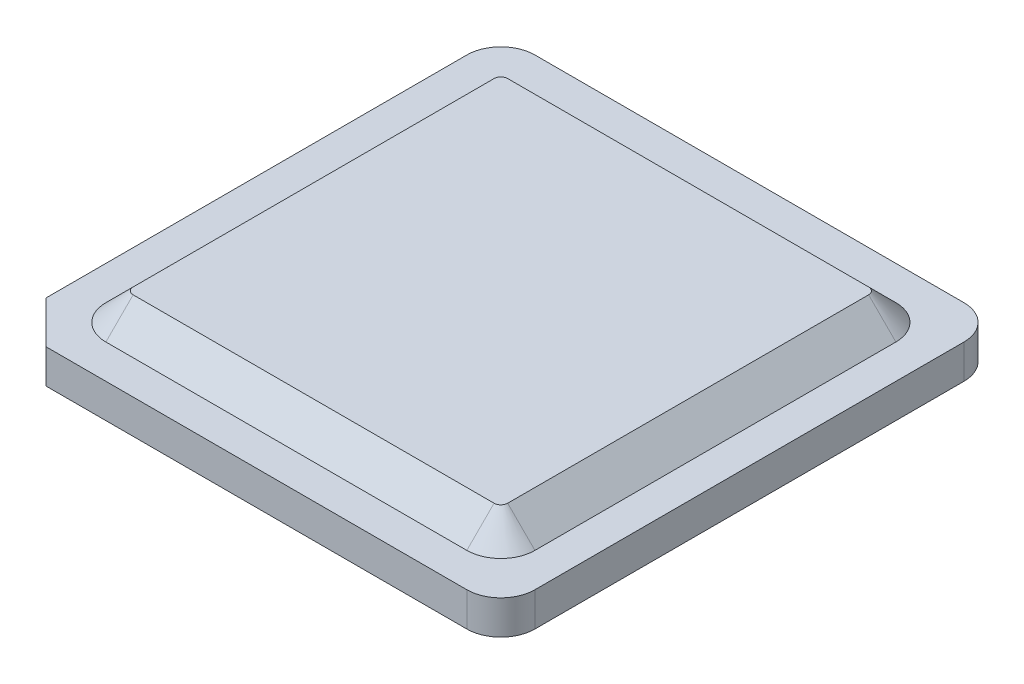
ISO-10303-21;
HEADER;
FILE_DESCRIPTION(('STEP AP214'),'2;1');
FILE_NAME('part.step','',(''),(''),'','','');
FILE_SCHEMA(('AUTOMOTIVE_DESIGN { 1 0 10303 214 1 1 1 1 }'));
ENDSEC;
DATA;
#1=APPLICATION_CONTEXT('core data for automotive mechanical design processes');
#2=APPLICATION_PROTOCOL_DEFINITION('international standard','automotive_design',2000,#1);
#3=PRODUCT_CONTEXT('',#1,'mechanical');
#4=PRODUCT('Part','Part','',(#3));
#5=PRODUCT_RELATED_PRODUCT_CATEGORY('part','',(#4));
#6=PRODUCT_DEFINITION_FORMATION('','',#4);
#7=PRODUCT_DEFINITION_CONTEXT('part definition',#1,'design');
#8=PRODUCT_DEFINITION('design','',#6,#7);
#9=PRODUCT_DEFINITION_SHAPE('','',#8);
#10=(LENGTH_UNIT() NAMED_UNIT(*) SI_UNIT(.MILLI.,.METRE.));
#11=(NAMED_UNIT(*) PLANE_ANGLE_UNIT() SI_UNIT($,.RADIAN.));
#12=(NAMED_UNIT(*) SI_UNIT($,.STERADIAN.) SOLID_ANGLE_UNIT());
#13=UNCERTAINTY_MEASURE_WITH_UNIT(LENGTH_MEASURE(1.E-05),#10,'distance_accuracy_value','');
#14=(GEOMETRIC_REPRESENTATION_CONTEXT(3) GLOBAL_UNCERTAINTY_ASSIGNED_CONTEXT((#13)) GLOBAL_UNIT_ASSIGNED_CONTEXT((#10,
#11,#12)) REPRESENTATION_CONTEXT('',''));
#15=CARTESIAN_POINT('',(0.,0.,0.));
#16=DIRECTION('',(0.,0.,1.));
#17=DIRECTION('',(1.,0.,0.));
#18=AXIS2_PLACEMENT_3D('',#15,#16,#17);
#19=CARTESIAN_POINT('',(-6.95,2.3,1.8));
#20=DIRECTION('',(0.,1.,0.));
#21=DIRECTION('',(0.,0.,-1.));
#22=AXIS2_PLACEMENT_3D('',#19,#20,#21);
#23=CYLINDRICAL_SURFACE('',#22,1.);
#24=CARTESIAN_POINT('',(-6.95,2.3,1.8));
#25=DIRECTION('',(0.,1.,0.));
#26=DIRECTION('',(0.,0.,1.));
#27=AXIS2_PLACEMENT_3D('',#24,#25,#26);
#28=CIRCLE('',#27,1.);
#29=CARTESIAN_POINT('',(-6.95,2.3,2.8));
#30=VERTEX_POINT('',#29);
#31=CARTESIAN_POINT('',(-5.95,2.3,1.8));
#32=VERTEX_POINT('',#31);
#33=EDGE_CURVE('E35',#30,#32,#28,.T.);
#34=ORIENTED_EDGE('',*,*,#33,.F.);
#35=DIRECTION('',(0.,-1.,0.));
#36=VECTOR('',#35,1.);
#37=CARTESIAN_POINT('',(-6.95,2.3,2.8));
#38=LINE('',#37,#36);
#39=CARTESIAN_POINT('',(-6.95,1.3,2.8));
#40=VERTEX_POINT('',#39);
#41=EDGE_CURVE('E11',#30,#40,#38,.T.);
#42=ORIENTED_EDGE('',*,*,#41,.T.);
#43=CARTESIAN_POINT('',(-6.95,1.3,1.8));
#44=DIRECTION('',(0.,1.,0.));
#45=DIRECTION('',(0.,0.,1.));
#46=AXIS2_PLACEMENT_3D('',#43,#44,#45);
#47=CIRCLE('',#46,1.);
#48=CARTESIAN_POINT('',(-5.95,1.3,1.8));
#49=VERTEX_POINT('',#48);
#50=EDGE_CURVE('E27',#40,#49,#47,.T.);
#51=ORIENTED_EDGE('',*,*,#50,.T.);
#52=DIRECTION('',(0.,-1.,0.));
#53=VECTOR('',#52,1.);
#54=CARTESIAN_POINT('',(-5.95,2.3,1.8));
#55=LINE('',#54,#53);
#56=EDGE_CURVE('E247',#32,#49,#55,.T.);
#57=ORIENTED_EDGE('',*,*,#56,.F.);
#58=EDGE_LOOP('',(#34,#42,#51,#57));
#59=FACE_BOUND('',#58,.T.);
#60=ADVANCED_FACE('F17',(#59),#23,.T.);
#61=CARTESIAN_POINT('',(-18.55,2.3,0.8));
#62=DIRECTION('',(0.,-1.,0.));
#63=DIRECTION('',(0.,0.,1.));
#64=AXIS2_PLACEMENT_3D('',#61,#62,#63);
#65=CONICAL_SURFACE('',#64,1.,0.785398163397);
#66=CARTESIAN_POINT('',(-18.55,2.3,0.8));
#67=DIRECTION('',(0.,1.,0.));
#68=DIRECTION('',(0.,0.,1.));
#69=AXIS2_PLACEMENT_3D('',#66,#67,#68);
#70=CIRCLE('',#69,1.);
#71=CARTESIAN_POINT('',(-19.55,2.3,0.8));
#72=VERTEX_POINT('',#71);
#73=CARTESIAN_POINT('',(-18.55,2.3,1.8));
#74=VERTEX_POINT('',#73);
#75=EDGE_CURVE('E239',#72,#74,#70,.T.);
#76=ORIENTED_EDGE('',*,*,#75,.T.);
#77=DIRECTION('',(0.,-0.707106781186548,0.707106781186548));
#78=VECTOR('',#77,1.);
#79=CARTESIAN_POINT('',(-18.55,2.3,1.8));
#80=LINE('',#79,#78);
#81=CARTESIAN_POINT('',(-18.55,3.1,1.));
#82=VERTEX_POINT('',#81);
#83=EDGE_CURVE('E176',#82,#74,#80,.T.);
#84=ORIENTED_EDGE('',*,*,#83,.F.);
#85=CARTESIAN_POINT('',(-18.55,3.1,0.8));
#86=DIRECTION('',(0.,1.,0.));
#87=DIRECTION('',(0.,0.,1.));
#88=AXIS2_PLACEMENT_3D('',#85,#86,#87);
#89=CIRCLE('',#88,0.2);
#90=CARTESIAN_POINT('',(-18.75,3.1,0.8));
#91=VERTEX_POINT('',#90);
#92=EDGE_CURVE('E147',#91,#82,#89,.T.);
#93=ORIENTED_EDGE('',*,*,#92,.F.);
#94=DIRECTION('',(-0.707106781186548,-0.707106781186548,0.));
#95=VECTOR('',#94,1.);
#96=CARTESIAN_POINT('',(-19.55,2.3,0.8));
#97=LINE('',#96,#95);
#98=EDGE_CURVE('E151',#91,#72,#97,.T.);
#99=ORIENTED_EDGE('',*,*,#98,.T.);
#100=EDGE_LOOP('',(#76,#84,#93,#99));
#101=FACE_BOUND('',#100,.T.);
#102=ADVANCED_FACE('F240',(#101),#65,.T.);
#103=CARTESIAN_POINT('',(-6.95,2.3,-10.8));
#104=DIRECTION('',(0.,1.,0.));
#105=DIRECTION('',(0.,0.,-1.));
#106=AXIS2_PLACEMENT_3D('',#103,#104,#105);
#107=CYLINDRICAL_SURFACE('',#106,1.);
#108=CARTESIAN_POINT('',(-6.95,2.3,-10.8));
#109=DIRECTION('',(0.,1.,0.));
#110=DIRECTION('',(0.,0.,1.));
#111=AXIS2_PLACEMENT_3D('',#108,#109,#110);
#112=CIRCLE('',#111,1.);
#113=CARTESIAN_POINT('',(-5.95,2.3,-10.8));
#114=VERTEX_POINT('',#113);
#115=CARTESIAN_POINT('',(-6.95,2.3,-11.8));
#116=VERTEX_POINT('',#115);
#117=EDGE_CURVE('E250',#114,#116,#112,.T.);
#118=ORIENTED_EDGE('',*,*,#117,.F.);
#119=DIRECTION('',(0.,-1.,0.));
#120=VECTOR('',#119,1.);
#121=CARTESIAN_POINT('',(-5.95,2.3,-10.8));
#122=LINE('',#121,#120);
#123=CARTESIAN_POINT('',(-5.95,1.3,-10.8));
#124=VERTEX_POINT('',#123);
#125=EDGE_CURVE('E244',#114,#124,#122,.T.);
#126=ORIENTED_EDGE('',*,*,#125,.T.);
#127=CARTESIAN_POINT('',(-6.95,1.3,-10.8));
#128=DIRECTION('',(0.,1.,0.));
#129=DIRECTION('',(0.,0.,1.));
#130=AXIS2_PLACEMENT_3D('',#127,#128,#129);
#131=CIRCLE('',#130,1.);
#132=CARTESIAN_POINT('',(-6.95,1.3,-11.8));
#133=VERTEX_POINT('',#132);
#134=EDGE_CURVE('E255',#124,#133,#131,.T.);
#135=ORIENTED_EDGE('',*,*,#134,.T.);
#136=DIRECTION('',(0.,-1.,0.));
#137=VECTOR('',#136,1.);
#138=CARTESIAN_POINT('',(-6.95,2.3,-11.8));
#139=LINE('',#138,#137);
#140=EDGE_CURVE('E259',#116,#133,#139,.T.);
#141=ORIENTED_EDGE('',*,*,#140,.F.);
#142=EDGE_LOOP('',(#118,#126,#135,#141));
#143=FACE_BOUND('',#142,.T.);
#144=ADVANCED_FACE('F294',(#143),#107,.T.);
#145=CARTESIAN_POINT('',(-5.95,2.3,-11.8));
#146=DIRECTION('',(-1.,0.,0.));
#147=DIRECTION('',(0.,0.,1.));
#148=AXIS2_PLACEMENT_3D('',#145,#146,#147);
#149=PLANE('',#148);
#150=DIRECTION('',(0.,0.,-1.));
#151=VECTOR('',#150,1.);
#152=CARTESIAN_POINT('',(-5.95,1.3,-11.8));
#153=LINE('',#152,#151);
#154=EDGE_CURVE('E258',#49,#124,#153,.T.);
#155=ORIENTED_EDGE('',*,*,#154,.T.);
#156=ORIENTED_EDGE('',*,*,#125,.F.);
#157=DIRECTION('',(0.,0.,-1.));
#158=VECTOR('',#157,1.);
#159=CARTESIAN_POINT('',(-5.95,2.3,-11.8));
#160=LINE('',#159,#158);
#161=EDGE_CURVE('E252',#32,#114,#160,.T.);
#162=ORIENTED_EDGE('',*,*,#161,.F.);
#163=ORIENTED_EDGE('',*,*,#56,.T.);
#164=EDGE_LOOP('',(#155,#156,#162,#163));
#165=FACE_BOUND('',#164,.T.);
#166=ADVANCED_FACE('F299',(#165),#149,.F.);
#167=CARTESIAN_POINT('',(-20.55,2.3,-11.8));
#168=DIRECTION('',(0.,0.,1.));
#169=DIRECTION('',(1.,0.,0.));
#170=AXIS2_PLACEMENT_3D('',#167,#168,#169);
#171=PLANE('',#170);
#172=DIRECTION('',(-1.,0.,0.));
#173=VECTOR('',#172,1.);
#174=CARTESIAN_POINT('',(-20.55,1.3,-11.8));
#175=LINE('',#174,#173);
#176=CARTESIAN_POINT('',(-19.55,1.3,-11.8));
#177=VERTEX_POINT('',#176);
#178=EDGE_CURVE('E261',#133,#177,#175,.T.);
#179=ORIENTED_EDGE('',*,*,#178,.T.);
#180=DIRECTION('',(0.,-1.,0.));
#181=VECTOR('',#180,1.);
#182=CARTESIAN_POINT('',(-19.55,2.3,-11.8));
#183=LINE('',#182,#181);
#184=CARTESIAN_POINT('',(-19.55,2.3,-11.8));
#185=VERTEX_POINT('',#184);
#186=EDGE_CURVE('E262',#185,#177,#183,.T.);
#187=ORIENTED_EDGE('',*,*,#186,.F.);
#188=DIRECTION('',(-1.,0.,0.));
#189=VECTOR('',#188,1.);
#190=CARTESIAN_POINT('',(-20.55,2.3,-11.8));
#191=LINE('',#190,#189);
#192=EDGE_CURVE('E271',#116,#185,#191,.T.);
#193=ORIENTED_EDGE('',*,*,#192,.F.);
#194=ORIENTED_EDGE('',*,*,#140,.T.);
#195=EDGE_LOOP('',(#179,#187,#193,#194));
#196=FACE_BOUND('',#195,.T.);
#197=ADVANCED_FACE('F303',(#196),#171,.F.);
#198=CARTESIAN_POINT('',(-19.55,2.3,-10.8));
#199=DIRECTION('',(0.,1.,0.));
#200=DIRECTION('',(0.,0.,-1.));
#201=AXIS2_PLACEMENT_3D('',#198,#199,#200);
#202=CYLINDRICAL_SURFACE('',#201,1.);
#203=CARTESIAN_POINT('',(-19.55,2.3,-10.8));
#204=DIRECTION('',(0.,1.,0.));
#205=DIRECTION('',(0.,0.,1.));
#206=AXIS2_PLACEMENT_3D('',#203,#204,#205);
#207=CIRCLE('',#206,1.);
#208=CARTESIAN_POINT('',(-20.55,2.3,-10.8));
#209=VERTEX_POINT('',#208);
#210=EDGE_CURVE('E185',#185,#209,#207,.T.);
#211=ORIENTED_EDGE('',*,*,#210,.F.);
#212=ORIENTED_EDGE('',*,*,#186,.T.);
#213=CARTESIAN_POINT('',(-19.55,1.3,-10.8));
#214=DIRECTION('',(0.,1.,0.));
#215=DIRECTION('',(0.,0.,1.));
#216=AXIS2_PLACEMENT_3D('',#213,#214,#215);
#217=CIRCLE('',#216,1.);
#218=CARTESIAN_POINT('',(-20.55,1.3,-10.8));
#219=VERTEX_POINT('',#218);
#220=EDGE_CURVE('E270',#177,#219,#217,.T.);
#221=ORIENTED_EDGE('',*,*,#220,.T.);
#222=DIRECTION('',(0.,-1.,0.));
#223=VECTOR('',#222,1.);
#224=CARTESIAN_POINT('',(-20.55,2.3,-10.8));
#225=LINE('',#224,#223);
#226=EDGE_CURVE('E199',#209,#219,#225,.T.);
#227=ORIENTED_EDGE('',*,*,#226,.F.);
#228=EDGE_LOOP('',(#211,#212,#221,#227));
#229=FACE_BOUND('',#228,.T.);
#230=ADVANCED_FACE('F307',(#229),#202,.T.);
#231=CARTESIAN_POINT('',(-13.25,1.3,-4.5));
#232=DIRECTION('',(0.,1.,0.));
#233=DIRECTION('',(0.,0.,1.));
#234=AXIS2_PLACEMENT_3D('',#231,#232,#233);
#235=PLANE('',#234);
#236=DIRECTION('',(0.,0.,1.));
#237=VECTOR('',#236,1.);
#238=CARTESIAN_POINT('',(-20.55,1.3,-11.8));
#239=LINE('',#238,#237);
#240=CARTESIAN_POINT('',(-20.55,1.3,1.558578643763));
#241=VERTEX_POINT('',#240);
#242=EDGE_CURVE('E180',#219,#241,#239,.T.);
#243=ORIENTED_EDGE('',*,*,#242,.F.);
#244=ORIENTED_EDGE('',*,*,#220,.F.);
#245=ORIENTED_EDGE('',*,*,#178,.F.);
#246=ORIENTED_EDGE('',*,*,#134,.F.);
#247=ORIENTED_EDGE('',*,*,#154,.F.);
#248=ORIENTED_EDGE('',*,*,#50,.F.);
#249=DIRECTION('',(1.,0.,0.));
#250=VECTOR('',#249,1.);
#251=CARTESIAN_POINT('',(-19.30857864376,1.3,2.8));
#252=LINE('',#251,#250);
#253=CARTESIAN_POINT('',(-19.30857864376,1.3,2.8));
#254=VERTEX_POINT('',#253);
#255=EDGE_CURVE('E195',#254,#40,#252,.T.);
#256=ORIENTED_EDGE('',*,*,#255,.F.);
#257=DIRECTION('',(0.707106781186548,0.,0.707106781186548));
#258=VECTOR('',#257,1.);
#259=CARTESIAN_POINT('',(-20.55,1.3,1.558578643763));
#260=LINE('',#259,#258);
#261=EDGE_CURVE('E157',#241,#254,#260,.T.);
#262=ORIENTED_EDGE('',*,*,#261,.F.);
#263=EDGE_LOOP('',(#243,#244,#245,#246,#247,#248,#256,#262));
#264=FACE_BOUND('',#263,.T.);
#265=ADVANCED_FACE('F286',(#264),#235,.F.);
#266=CARTESIAN_POINT('',(-13.25,2.3,-4.5));
#267=DIRECTION('',(0.,1.,0.));
#268=DIRECTION('',(0.,0.,1.));
#269=AXIS2_PLACEMENT_3D('',#266,#267,#268);
#270=PLANE('',#269);
#271=ORIENTED_EDGE('',*,*,#75,.F.);
#272=DIRECTION('',(0.,0.,1.));
#273=VECTOR('',#272,1.);
#274=CARTESIAN_POINT('',(-19.55,2.3,-9.8));
#275=LINE('',#274,#273);
#276=CARTESIAN_POINT('',(-19.55,2.3,-9.8));
#277=VERTEX_POINT('',#276);
#278=EDGE_CURVE('E152',#277,#72,#275,.T.);
#279=ORIENTED_EDGE('',*,*,#278,.F.);
#280=CARTESIAN_POINT('',(-18.55,2.3,-9.8));
#281=DIRECTION('',(0.,1.,0.));
#282=DIRECTION('',(0.,0.,1.));
#283=AXIS2_PLACEMENT_3D('',#280,#281,#282);
#284=CIRCLE('',#283,1.);
#285=CARTESIAN_POINT('',(-18.55,2.3,-10.8));
#286=VERTEX_POINT('',#285);
#287=EDGE_CURVE('E144',#286,#277,#284,.T.);
#288=ORIENTED_EDGE('',*,*,#287,.F.);
#289=DIRECTION('',(-1.,0.,0.));
#290=VECTOR('',#289,1.);
#291=CARTESIAN_POINT('',(-18.55,2.3,-10.8));
#292=LINE('',#291,#290);
#293=CARTESIAN_POINT('',(-7.95,2.3,-10.8));
#294=VERTEX_POINT('',#293);
#295=EDGE_CURVE('E161',#294,#286,#292,.T.);
#296=ORIENTED_EDGE('',*,*,#295,.F.);
#297=CARTESIAN_POINT('',(-7.95,2.3,-9.8));
#298=DIRECTION('',(0.,1.,0.));
#299=DIRECTION('',(0.,0.,1.));
#300=AXIS2_PLACEMENT_3D('',#297,#298,#299);
#301=CIRCLE('',#300,1.);
#302=CARTESIAN_POINT('',(-6.95,2.3,-9.8));
#303=VERTEX_POINT('',#302);
#304=EDGE_CURVE('E164',#303,#294,#301,.T.);
#305=ORIENTED_EDGE('',*,*,#304,.F.);
#306=DIRECTION('',(0.,0.,-1.));
#307=VECTOR('',#306,1.);
#308=CARTESIAN_POINT('',(-6.95,2.3,-9.8));
#309=LINE('',#308,#307);
#310=CARTESIAN_POINT('',(-6.95,2.3,0.8));
#311=VERTEX_POINT('',#310);
#312=EDGE_CURVE('E168',#311,#303,#309,.T.);
#313=ORIENTED_EDGE('',*,*,#312,.F.);
#314=CARTESIAN_POINT('',(-7.95,2.3,0.8));
#315=DIRECTION('',(0.,1.,0.));
#316=DIRECTION('',(0.,0.,1.));
#317=AXIS2_PLACEMENT_3D('',#314,#315,#316);
#318=CIRCLE('',#317,1.);
#319=CARTESIAN_POINT('',(-7.95,2.3,1.8));
#320=VERTEX_POINT('',#319);
#321=EDGE_CURVE('E173',#320,#311,#318,.T.);
#322=ORIENTED_EDGE('',*,*,#321,.F.);
#323=DIRECTION('',(1.,0.,0.));
#324=VECTOR('',#323,1.);
#325=CARTESIAN_POINT('',(-18.55,2.3,1.8));
#326=LINE('',#325,#324);
#327=EDGE_CURVE('E177',#74,#320,#326,.T.);
#328=ORIENTED_EDGE('',*,*,#327,.F.);
#329=EDGE_LOOP('',(#271,#279,#288,#296,#305,#313,#322,#328));
#330=FACE_BOUND('',#329,.T.);
#331=ORIENTED_EDGE('',*,*,#192,.T.);
#332=ORIENTED_EDGE('',*,*,#210,.T.);
#333=DIRECTION('',(0.,0.,1.));
#334=VECTOR('',#333,1.);
#335=CARTESIAN_POINT('',(-20.55,2.3,-11.8));
#336=LINE('',#335,#334);
#337=CARTESIAN_POINT('',(-20.55,2.3,1.558578643763));
#338=VERTEX_POINT('',#337);
#339=EDGE_CURVE('E182',#209,#338,#336,.T.);
#340=ORIENTED_EDGE('',*,*,#339,.T.);
#341=DIRECTION('',(0.707106781186548,0.,0.707106781186548));
#342=VECTOR('',#341,1.);
#343=CARTESIAN_POINT('',(-20.55,2.3,1.558578643763));
#344=LINE('',#343,#342);
#345=CARTESIAN_POINT('',(-19.30857864376,2.3,2.8));
#346=VERTEX_POINT('',#345);
#347=EDGE_CURVE('E186',#338,#346,#344,.T.);
#348=ORIENTED_EDGE('',*,*,#347,.T.);
#349=DIRECTION('',(1.,0.,0.));
#350=VECTOR('',#349,1.);
#351=CARTESIAN_POINT('',(-19.30857864376,2.3,2.8));
#352=LINE('',#351,#350);
#353=EDGE_CURVE('E189',#346,#30,#352,.T.);
#354=ORIENTED_EDGE('',*,*,#353,.T.);
#355=ORIENTED_EDGE('',*,*,#33,.T.);
#356=ORIENTED_EDGE('',*,*,#161,.T.);
#357=ORIENTED_EDGE('',*,*,#117,.T.);
#358=EDGE_LOOP('',(#331,#332,#340,#348,#354,#355,#356,#357));
#359=FACE_BOUND('',#358,.T.);
#360=ADVANCED_FACE('F222',(#330,#359),#270,.T.);
#361=CARTESIAN_POINT('',(-19.30857864376,2.3,2.8));
#362=DIRECTION('',(0.,0.,-1.));
#363=DIRECTION('',(-1.,0.,0.));
#364=AXIS2_PLACEMENT_3D('',#361,#362,#363);
#365=PLANE('',#364);
#366=ORIENTED_EDGE('',*,*,#255,.T.);
#367=ORIENTED_EDGE('',*,*,#41,.F.);
#368=ORIENTED_EDGE('',*,*,#353,.F.);
#369=DIRECTION('',(0.,-1.,0.));
#370=VECTOR('',#369,1.);
#371=CARTESIAN_POINT('',(-19.30857864376,2.3,2.8));
#372=LINE('',#371,#370);
#373=EDGE_CURVE('E192',#346,#254,#372,.T.);
#374=ORIENTED_EDGE('',*,*,#373,.T.);
#375=EDGE_LOOP('',(#366,#367,#368,#374));
#376=FACE_BOUND('',#375,.T.);
#377=ADVANCED_FACE('F281',(#376),#365,.F.);
#378=CARTESIAN_POINT('',(-20.55,2.3,1.558578643763));
#379=DIRECTION('',(0.707106781186548,0.,-0.707106781186548));
#380=DIRECTION('',(-0.707106781186548,0.,-0.707106781186548));
#381=AXIS2_PLACEMENT_3D('',#378,#379,#380);
#382=PLANE('',#381);
#383=ORIENTED_EDGE('',*,*,#261,.T.);
#384=ORIENTED_EDGE('',*,*,#373,.F.);
#385=ORIENTED_EDGE('',*,*,#347,.F.);
#386=DIRECTION('',(0.,-1.,0.));
#387=VECTOR('',#386,1.);
#388=CARTESIAN_POINT('',(-20.55,2.3,1.558578643763));
#389=LINE('',#388,#387);
#390=EDGE_CURVE('E196',#338,#241,#389,.T.);
#391=ORIENTED_EDGE('',*,*,#390,.T.);
#392=EDGE_LOOP('',(#383,#384,#385,#391));
#393=FACE_BOUND('',#392,.T.);
#394=ADVANCED_FACE('F318',(#393),#382,.F.);
#395=CARTESIAN_POINT('',(-20.55,2.3,-11.8));
#396=DIRECTION('',(1.,0.,0.));
#397=DIRECTION('',(0.,0.,-1.));
#398=AXIS2_PLACEMENT_3D('',#395,#396,#397);
#399=PLANE('',#398);
#400=ORIENTED_EDGE('',*,*,#339,.F.);
#401=ORIENTED_EDGE('',*,*,#226,.T.);
#402=ORIENTED_EDGE('',*,*,#242,.T.);
#403=ORIENTED_EDGE('',*,*,#390,.F.);
#404=EDGE_LOOP('',(#400,#401,#402,#403));
#405=FACE_BOUND('',#404,.T.);
#406=ADVANCED_FACE('F321',(#405),#399,.F.);
#407=CARTESIAN_POINT('',(-18.55,2.3,1.8));
#408=DIRECTION('',(0.,0.707106781186548,0.707106781186548));
#409=DIRECTION('',(0.,-0.707106781186548,0.707106781186548));
#410=AXIS2_PLACEMENT_3D('',#407,#408,#409);
#411=PLANE('',#410);
#412=ORIENTED_EDGE('',*,*,#327,.T.);
#413=DIRECTION('',(0.,-0.707106781186548,0.707106781186548));
#414=VECTOR('',#413,1.);
#415=CARTESIAN_POINT('',(-7.95,2.3,1.8));
#416=LINE('',#415,#414);
#417=CARTESIAN_POINT('',(-7.95,3.1,1.));
#418=VERTEX_POINT('',#417);
#419=EDGE_CURVE('E171',#418,#320,#416,.T.);
#420=ORIENTED_EDGE('',*,*,#419,.F.);
#421=DIRECTION('',(-1.,0.,0.));
#422=VECTOR('',#421,1.);
#423=CARTESIAN_POINT('',(-18.55,3.1,1.));
#424=LINE('',#423,#422);
#425=EDGE_CURVE('E181',#418,#82,#424,.T.);
#426=ORIENTED_EDGE('',*,*,#425,.T.);
#427=ORIENTED_EDGE('',*,*,#83,.T.);
#428=EDGE_LOOP('',(#412,#420,#426,#427));
#429=FACE_BOUND('',#428,.T.);
#430=ADVANCED_FACE('F233',(#429),#411,.T.);
#431=CARTESIAN_POINT('',(-7.95,2.3,0.8));
#432=DIRECTION('',(0.,-1.,0.));
#433=DIRECTION('',(0.,0.,1.));
#434=AXIS2_PLACEMENT_3D('',#431,#432,#433);
#435=CONICAL_SURFACE('',#434,1.,0.785398163397);
#436=ORIENTED_EDGE('',*,*,#321,.T.);
#437=DIRECTION('',(0.707106781186548,-0.707106781186548,0.));
#438=VECTOR('',#437,1.);
#439=CARTESIAN_POINT('',(-6.95,2.3,0.8));
#440=LINE('',#439,#438);
#441=CARTESIAN_POINT('',(-7.75,3.1,0.8));
#442=VERTEX_POINT('',#441);
#443=EDGE_CURVE('E167',#442,#311,#440,.T.);
#444=ORIENTED_EDGE('',*,*,#443,.F.);
#445=CARTESIAN_POINT('',(-7.95,3.1,0.8));
#446=DIRECTION('',(0.,1.,0.));
#447=DIRECTION('',(0.,0.,1.));
#448=AXIS2_PLACEMENT_3D('',#445,#446,#447);
#449=CIRCLE('',#448,0.2);
#450=EDGE_CURVE('E206',#418,#442,#449,.T.);
#451=ORIENTED_EDGE('',*,*,#450,.F.);
#452=ORIENTED_EDGE('',*,*,#419,.T.);
#453=EDGE_LOOP('',(#436,#444,#451,#452));
#454=FACE_BOUND('',#453,.T.);
#455=ADVANCED_FACE('F230',(#454),#435,.T.);
#456=CARTESIAN_POINT('',(-6.95,2.3,-9.8));
#457=DIRECTION('',(0.707106781186548,0.707106781186548,0.));
#458=DIRECTION('',(-0.707106781186548,0.707106781186548,0.));
#459=AXIS2_PLACEMENT_3D('',#456,#457,#458);
#460=PLANE('',#459);
#461=ORIENTED_EDGE('',*,*,#312,.T.);
#462=DIRECTION('',(0.707106781186548,-0.707106781186548,0.));
#463=VECTOR('',#462,1.);
#464=CARTESIAN_POINT('',(-6.95,2.3,-9.8));
#465=LINE('',#464,#463);
#466=CARTESIAN_POINT('',(-7.75,3.1,-9.8));
#467=VERTEX_POINT('',#466);
#468=EDGE_CURVE('E163',#467,#303,#465,.T.);
#469=ORIENTED_EDGE('',*,*,#468,.F.);
#470=DIRECTION('',(0.,0.,1.));
#471=VECTOR('',#470,1.);
#472=CARTESIAN_POINT('',(-7.75,3.1,-9.8));
#473=LINE('',#472,#471);
#474=EDGE_CURVE('E172',#467,#442,#473,.T.);
#475=ORIENTED_EDGE('',*,*,#474,.T.);
#476=ORIENTED_EDGE('',*,*,#443,.T.);
#477=EDGE_LOOP('',(#461,#469,#475,#476));
#478=FACE_BOUND('',#477,.T.);
#479=ADVANCED_FACE('F225',(#478),#460,.T.);
#480=CARTESIAN_POINT('',(-7.95,2.3,-9.8));
#481=DIRECTION('',(0.,-1.,0.));
#482=DIRECTION('',(0.,0.,1.));
#483=AXIS2_PLACEMENT_3D('',#480,#481,#482);
#484=CONICAL_SURFACE('',#483,1.,0.785398163397);
#485=ORIENTED_EDGE('',*,*,#304,.T.);
#486=DIRECTION('',(0.,-0.707106781186548,-0.707106781186548));
#487=VECTOR('',#486,1.);
#488=CARTESIAN_POINT('',(-7.95,2.3,-10.8));
#489=LINE('',#488,#487);
#490=CARTESIAN_POINT('',(-7.95,3.1,-10.));
#491=VERTEX_POINT('',#490);
#492=EDGE_CURVE('E160',#491,#294,#489,.T.);
#493=ORIENTED_EDGE('',*,*,#492,.F.);
#494=CARTESIAN_POINT('',(-7.95,3.1,-9.8));
#495=DIRECTION('',(0.,1.,0.));
#496=DIRECTION('',(0.,0.,1.));
#497=AXIS2_PLACEMENT_3D('',#494,#495,#496);
#498=CIRCLE('',#497,0.2);
#499=EDGE_CURVE('E139',#467,#491,#498,.T.);
#500=ORIENTED_EDGE('',*,*,#499,.F.);
#501=ORIENTED_EDGE('',*,*,#468,.T.);
#502=EDGE_LOOP('',(#485,#493,#500,#501));
#503=FACE_BOUND('',#502,.T.);
#504=ADVANCED_FACE('F219',(#503),#484,.T.);
#505=CARTESIAN_POINT('',(-18.55,2.3,-10.8));
#506=DIRECTION('',(0.,0.707106781186548,-0.707106781186548));
#507=DIRECTION('',(0.,0.707106781186548,0.707106781186548));
#508=AXIS2_PLACEMENT_3D('',#505,#506,#507);
#509=PLANE('',#508);
#510=ORIENTED_EDGE('',*,*,#295,.T.);
#511=DIRECTION('',(0.,-0.707106781186548,-0.707106781186548));
#512=VECTOR('',#511,1.);
#513=CARTESIAN_POINT('',(-18.55,2.3,-10.8));
#514=LINE('',#513,#512);
#515=CARTESIAN_POINT('',(-18.55,3.1,-10.));
#516=VERTEX_POINT('',#515);
#517=EDGE_CURVE('E128',#516,#286,#514,.T.);
#518=ORIENTED_EDGE('',*,*,#517,.F.);
#519=DIRECTION('',(1.,0.,0.));
#520=VECTOR('',#519,1.);
#521=CARTESIAN_POINT('',(-18.55,3.1,-10.));
#522=LINE('',#521,#520);
#523=EDGE_CURVE('E137',#516,#491,#522,.T.);
#524=ORIENTED_EDGE('',*,*,#523,.T.);
#525=ORIENTED_EDGE('',*,*,#492,.T.);
#526=EDGE_LOOP('',(#510,#518,#524,#525));
#527=FACE_BOUND('',#526,.T.);
#528=ADVANCED_FACE('F215',(#527),#509,.T.);
#529=CARTESIAN_POINT('',(-18.55,2.3,-9.8));
#530=DIRECTION('',(0.,-1.,0.));
#531=DIRECTION('',(0.,0.,1.));
#532=AXIS2_PLACEMENT_3D('',#529,#530,#531);
#533=CONICAL_SURFACE('',#532,1.,0.785398163397);
#534=ORIENTED_EDGE('',*,*,#287,.T.);
#535=DIRECTION('',(-0.707106781186548,-0.707106781186548,0.));
#536=VECTOR('',#535,1.);
#537=CARTESIAN_POINT('',(-19.55,2.3,-9.8));
#538=LINE('',#537,#536);
#539=CARTESIAN_POINT('',(-18.75,3.1,-9.8));
#540=VERTEX_POINT('',#539);
#541=EDGE_CURVE('E142',#540,#277,#538,.T.);
#542=ORIENTED_EDGE('',*,*,#541,.F.);
#543=CARTESIAN_POINT('',(-18.55,3.1,-9.8));
#544=DIRECTION('',(0.,1.,0.));
#545=DIRECTION('',(0.,0.,1.));
#546=AXIS2_PLACEMENT_3D('',#543,#544,#545);
#547=CIRCLE('',#546,0.2);
#548=EDGE_CURVE('E134',#516,#540,#547,.T.);
#549=ORIENTED_EDGE('',*,*,#548,.F.);
#550=ORIENTED_EDGE('',*,*,#517,.T.);
#551=EDGE_LOOP('',(#534,#542,#549,#550));
#552=FACE_BOUND('',#551,.T.);
#553=ADVANCED_FACE('F143',(#552),#533,.T.);
#554=CARTESIAN_POINT('',(-19.55,2.3,-9.8));
#555=DIRECTION('',(-0.707106781186548,0.707106781186548,0.));
#556=DIRECTION('',(-0.707106781186548,-0.707106781186548,0.));
#557=AXIS2_PLACEMENT_3D('',#554,#555,#556);
#558=PLANE('',#557);
#559=ORIENTED_EDGE('',*,*,#278,.T.);
#560=ORIENTED_EDGE('',*,*,#98,.F.);
#561=DIRECTION('',(0.,0.,-1.));
#562=VECTOR('',#561,1.);
#563=CARTESIAN_POINT('',(-18.75,3.1,-9.8));
#564=LINE('',#563,#562);
#565=EDGE_CURVE('E21',#91,#540,#564,.T.);
#566=ORIENTED_EDGE('',*,*,#565,.T.);
#567=ORIENTED_EDGE('',*,*,#541,.T.);
#568=EDGE_LOOP('',(#559,#560,#566,#567));
#569=FACE_BOUND('',#568,.T.);
#570=ADVANCED_FACE('F150',(#569),#558,.T.);
#571=CARTESIAN_POINT('',(-18.55,3.1,0.8));
#572=DIRECTION('',(0.,1.,0.));
#573=DIRECTION('',(0.,0.,1.));
#574=AXIS2_PLACEMENT_3D('',#571,#572,#573);
#575=PLANE('',#574);
#576=ORIENTED_EDGE('',*,*,#92,.T.);
#577=ORIENTED_EDGE('',*,*,#425,.F.);
#578=ORIENTED_EDGE('',*,*,#450,.T.);
#579=ORIENTED_EDGE('',*,*,#474,.F.);
#580=ORIENTED_EDGE('',*,*,#499,.T.);
#581=ORIENTED_EDGE('',*,*,#523,.F.);
#582=ORIENTED_EDGE('',*,*,#548,.T.);
#583=ORIENTED_EDGE('',*,*,#565,.F.);
#584=EDGE_LOOP('',(#576,#577,#578,#579,#580,#581,#582,#583));
#585=FACE_BOUND('',#584,.T.);
#586=ADVANCED_FACE('F19',(#585),#575,.T.);
#587=CLOSED_SHELL('',(#60,#102,#144,#166,#197,#230,#265,#360,#377,#394,#406,#430,#455,#479,#504,
#528,#553,#570,#586));
#588=MANIFOLD_SOLID_BREP('B1',#587);
#589=ADVANCED_BREP_SHAPE_REPRESENTATION('',(#18,#588),#14);
#590=SHAPE_DEFINITION_REPRESENTATION(#9,#589);
ENDSEC;
END-ISO-10303-21;
